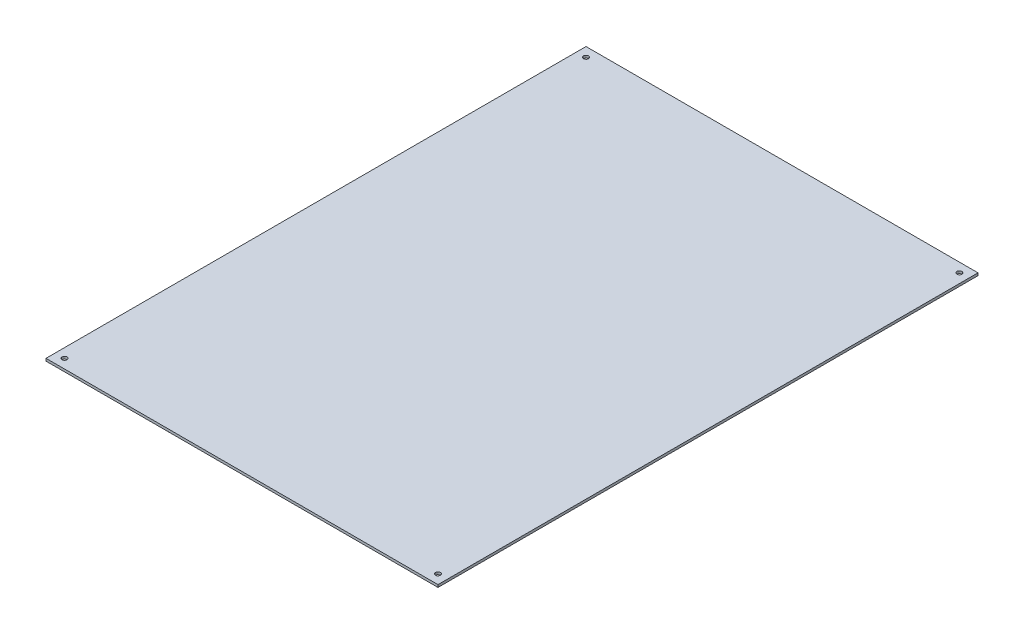
ISO-10303-21;
HEADER;
FILE_DESCRIPTION(('STEP AP214'),'2;1');
FILE_NAME('part.step','',(''),(''),'','','');
FILE_SCHEMA(('AUTOMOTIVE_DESIGN { 1 0 10303 214 1 1 1 1 }'));
ENDSEC;
DATA;
#1=APPLICATION_CONTEXT('core data for automotive mechanical design processes');
#2=APPLICATION_PROTOCOL_DEFINITION('international standard','automotive_design',2000,#1);
#3=PRODUCT_CONTEXT('',#1,'mechanical');
#4=PRODUCT('Part','Part','',(#3));
#5=PRODUCT_RELATED_PRODUCT_CATEGORY('part','',(#4));
#6=PRODUCT_DEFINITION_FORMATION('','',#4);
#7=PRODUCT_DEFINITION_CONTEXT('part definition',#1,'design');
#8=PRODUCT_DEFINITION('design','',#6,#7);
#9=PRODUCT_DEFINITION_SHAPE('','',#8);
#10=(LENGTH_UNIT() NAMED_UNIT(*) SI_UNIT(.MILLI.,.METRE.));
#11=(NAMED_UNIT(*) PLANE_ANGLE_UNIT() SI_UNIT($,.RADIAN.));
#12=(NAMED_UNIT(*) SI_UNIT($,.STERADIAN.) SOLID_ANGLE_UNIT());
#13=UNCERTAINTY_MEASURE_WITH_UNIT(LENGTH_MEASURE(1.E-05),#10,'distance_accuracy_value','');
#14=(GEOMETRIC_REPRESENTATION_CONTEXT(3) GLOBAL_UNCERTAINTY_ASSIGNED_CONTEXT((#13)) GLOBAL_UNIT_ASSIGNED_CONTEXT((#10,
#11,#12)) REPRESENTATION_CONTEXT('',''));
#15=CARTESIAN_POINT('',(0.,0.,0.));
#16=DIRECTION('',(0.,0.,1.));
#17=DIRECTION('',(1.,0.,0.));
#18=AXIS2_PLACEMENT_3D('',#15,#16,#17);
#19=CARTESIAN_POINT('',(157.875,0.,0.));
#20=DIRECTION('',(0.,0.,-1.));
#21=DIRECTION('',(-1.,0.,0.));
#22=AXIS2_PLACEMENT_3D('',#19,#20,#21);
#23=PLANE('',#22);
#24=DIRECTION('',(-1.,0.,0.));
#25=VECTOR('',#24,1.);
#26=CARTESIAN_POINT('',(157.875,2.,0.));
#27=LINE('',#26,#25);
#28=CARTESIAN_POINT('',(157.875,2.,0.));
#29=VERTEX_POINT('',#28);
#30=CARTESIAN_POINT('',(-157.875,2.,0.));
#31=VERTEX_POINT('',#30);
#32=EDGE_CURVE('E72',#29,#31,#27,.T.);
#33=ORIENTED_EDGE('',*,*,#32,.T.);
#34=DIRECTION('',(0.,-1.,0.));
#35=VECTOR('',#34,1.);
#36=CARTESIAN_POINT('',(-157.875,0.,0.));
#37=LINE('',#36,#35);
#38=CARTESIAN_POINT('',(-157.875,0.,0.));
#39=VERTEX_POINT('',#38);
#40=EDGE_CURVE('E75',#31,#39,#37,.T.);
#41=ORIENTED_EDGE('',*,*,#40,.T.);
#42=DIRECTION('',(-1.,0.,0.));
#43=VECTOR('',#42,1.);
#44=CARTESIAN_POINT('',(157.875,0.,0.));
#45=LINE('',#44,#43);
#46=CARTESIAN_POINT('',(157.875,0.,0.));
#47=VERTEX_POINT('',#46);
#48=EDGE_CURVE('E11',#47,#39,#45,.T.);
#49=ORIENTED_EDGE('',*,*,#48,.F.);
#50=DIRECTION('',(0.,-1.,0.));
#51=VECTOR('',#50,1.);
#52=CARTESIAN_POINT('',(157.875,0.,0.));
#53=LINE('',#52,#51);
#54=EDGE_CURVE('E77',#29,#47,#53,.T.);
#55=ORIENTED_EDGE('',*,*,#54,.F.);
#56=EDGE_LOOP('',(#33,#41,#49,#55));
#57=FACE_BOUND('',#56,.T.);
#58=ADVANCED_FACE('F33',(#57),#23,.F.);
#59=CARTESIAN_POINT('',(157.875,0.,0.));
#60=DIRECTION('',(0.,1.,0.));
#61=DIRECTION('',(0.,0.,1.));
#62=AXIS2_PLACEMENT_3D('',#59,#60,#61);
#63=PLANE('',#62);
#64=CARTESIAN_POINT('',(-150.375,0.,-427.5));
#65=DIRECTION('',(0.,1.,0.));
#66=DIRECTION('',(0.,0.,1.));
#67=AXIS2_PLACEMENT_3D('',#64,#65,#66);
#68=CIRCLE('',#67,2.);
#69=CARTESIAN_POINT('',(-150.375,0.,-425.5));
#70=VERTEX_POINT('',#69);
#71=EDGE_CURVE('E146',#70,#70,#68,.T.);
#72=ORIENTED_EDGE('',*,*,#71,.T.);
#73=EDGE_LOOP('',(#72));
#74=FACE_BOUND('',#73,.T.);
#75=CARTESIAN_POINT('',(-150.375,0.,-7.50000000000001));
#76=DIRECTION('',(0.,1.,0.));
#77=DIRECTION('',(0.,0.,1.));
#78=AXIS2_PLACEMENT_3D('',#75,#76,#77);
#79=CIRCLE('',#78,2.);
#80=CARTESIAN_POINT('',(-150.375,0.,-5.50000000000001));
#81=VERTEX_POINT('',#80);
#82=EDGE_CURVE('E150',#81,#81,#79,.T.);
#83=ORIENTED_EDGE('',*,*,#82,.T.);
#84=EDGE_LOOP('',(#83));
#85=FACE_BOUND('',#84,.T.);
#86=CARTESIAN_POINT('',(150.375,0.,-427.5));
#87=DIRECTION('',(0.,1.,0.));
#88=DIRECTION('',(0.,0.,1.));
#89=AXIS2_PLACEMENT_3D('',#86,#87,#88);
#90=CIRCLE('',#89,2.);
#91=CARTESIAN_POINT('',(150.375,0.,-425.5));
#92=VERTEX_POINT('',#91);
#93=EDGE_CURVE('E103',#92,#92,#90,.F.);
#94=ORIENTED_EDGE('',*,*,#93,.F.);
#95=EDGE_LOOP('',(#94));
#96=FACE_BOUND('',#95,.T.);
#97=CARTESIAN_POINT('',(150.375,0.,-7.50000000000001));
#98=DIRECTION('',(0.,1.,0.));
#99=DIRECTION('',(0.,0.,1.));
#100=AXIS2_PLACEMENT_3D('',#97,#98,#99);
#101=CIRCLE('',#100,2.);
#102=CARTESIAN_POINT('',(150.375,0.,-5.50000000000001));
#103=VERTEX_POINT('',#102);
#104=EDGE_CURVE('E104',#103,#103,#101,.F.);
#105=ORIENTED_EDGE('',*,*,#104,.F.);
#106=EDGE_LOOP('',(#105));
#107=FACE_BOUND('',#106,.T.);
#108=ORIENTED_EDGE('',*,*,#48,.T.);
#109=DIRECTION('',(0.,0.,-1.));
#110=VECTOR('',#109,1.);
#111=CARTESIAN_POINT('',(-157.875,0.,0.));
#112=LINE('',#111,#110);
#113=CARTESIAN_POINT('',(-157.875,0.,-435.));
#114=VERTEX_POINT('',#113);
#115=EDGE_CURVE('E89',#39,#114,#112,.T.);
#116=ORIENTED_EDGE('',*,*,#115,.T.);
#117=DIRECTION('',(-1.,0.,0.));
#118=VECTOR('',#117,1.);
#119=CARTESIAN_POINT('',(157.875,0.,-435.));
#120=LINE('',#119,#118);
#121=CARTESIAN_POINT('',(157.875,0.,-435.));
#122=VERTEX_POINT('',#121);
#123=EDGE_CURVE('E40',#122,#114,#120,.T.);
#124=ORIENTED_EDGE('',*,*,#123,.F.);
#125=DIRECTION('',(0.,0.,-1.));
#126=VECTOR('',#125,1.);
#127=CARTESIAN_POINT('',(157.875,0.,0.));
#128=LINE('',#127,#126);
#129=EDGE_CURVE('E112',#47,#122,#128,.T.);
#130=ORIENTED_EDGE('',*,*,#129,.F.);
#131=EDGE_LOOP('',(#108,#116,#124,#130));
#132=FACE_BOUND('',#131,.T.);
#133=ADVANCED_FACE('F120',(#74,#85,#96,#107,#132),#63,.F.);
#134=CARTESIAN_POINT('',(157.875,0.,-435.));
#135=DIRECTION('',(0.,0.,1.));
#136=DIRECTION('',(1.,0.,0.));
#137=AXIS2_PLACEMENT_3D('',#134,#135,#136);
#138=PLANE('',#137);
#139=ORIENTED_EDGE('',*,*,#123,.T.);
#140=DIRECTION('',(0.,1.,0.));
#141=VECTOR('',#140,1.);
#142=CARTESIAN_POINT('',(-157.875,0.,-435.));
#143=LINE('',#142,#141);
#144=CARTESIAN_POINT('',(-157.875,2.,-435.));
#145=VERTEX_POINT('',#144);
#146=EDGE_CURVE('E93',#114,#145,#143,.T.);
#147=ORIENTED_EDGE('',*,*,#146,.T.);
#148=DIRECTION('',(-1.,0.,0.));
#149=VECTOR('',#148,1.);
#150=CARTESIAN_POINT('',(157.875,2.,-435.));
#151=LINE('',#150,#149);
#152=CARTESIAN_POINT('',(157.875,2.,-435.));
#153=VERTEX_POINT('',#152);
#154=EDGE_CURVE('E80',#153,#145,#151,.T.);
#155=ORIENTED_EDGE('',*,*,#154,.F.);
#156=DIRECTION('',(0.,1.,0.));
#157=VECTOR('',#156,1.);
#158=CARTESIAN_POINT('',(157.875,0.,-435.));
#159=LINE('',#158,#157);
#160=EDGE_CURVE('E52',#122,#153,#159,.T.);
#161=ORIENTED_EDGE('',*,*,#160,.F.);
#162=EDGE_LOOP('',(#139,#147,#155,#161));
#163=FACE_BOUND('',#162,.T.);
#164=ADVANCED_FACE('F118',(#163),#138,.F.);
#165=CARTESIAN_POINT('',(157.875,2.,0.));
#166=DIRECTION('',(0.,-1.,0.));
#167=DIRECTION('',(0.,0.,-1.));
#168=AXIS2_PLACEMENT_3D('',#165,#166,#167);
#169=PLANE('',#168);
#170=CARTESIAN_POINT('',(-150.375,2.,-427.5));
#171=DIRECTION('',(0.,-1.,0.));
#172=DIRECTION('',(0.,0.,1.));
#173=AXIS2_PLACEMENT_3D('',#170,#171,#172);
#174=CIRCLE('',#173,2.);
#175=CARTESIAN_POINT('',(-150.375,2.,-425.5));
#176=VERTEX_POINT('',#175);
#177=EDGE_CURVE('E90',#176,#176,#174,.T.);
#178=ORIENTED_EDGE('',*,*,#177,.T.);
#179=EDGE_LOOP('',(#178));
#180=FACE_BOUND('',#179,.T.);
#181=CARTESIAN_POINT('',(-150.375,2.,-7.50000000000001));
#182=DIRECTION('',(0.,-1.,0.));
#183=DIRECTION('',(0.,0.,1.));
#184=AXIS2_PLACEMENT_3D('',#181,#182,#183);
#185=CIRCLE('',#184,2.);
#186=CARTESIAN_POINT('',(-150.375,2.,-5.50000000000001));
#187=VERTEX_POINT('',#186);
#188=EDGE_CURVE('E176',#187,#187,#185,.T.);
#189=ORIENTED_EDGE('',*,*,#188,.T.);
#190=EDGE_LOOP('',(#189));
#191=FACE_BOUND('',#190,.T.);
#192=CARTESIAN_POINT('',(150.375,2.,-427.5));
#193=DIRECTION('',(0.,1.,0.));
#194=DIRECTION('',(0.,0.,1.));
#195=AXIS2_PLACEMENT_3D('',#192,#193,#194);
#196=CIRCLE('',#195,2.);
#197=CARTESIAN_POINT('',(150.375,2.,-425.5));
#198=VERTEX_POINT('',#197);
#199=EDGE_CURVE('E100',#198,#198,#196,.T.);
#200=ORIENTED_EDGE('',*,*,#199,.F.);
#201=EDGE_LOOP('',(#200));
#202=FACE_BOUND('',#201,.T.);
#203=CARTESIAN_POINT('',(150.375,2.,-7.50000000000001));
#204=DIRECTION('',(0.,1.,0.));
#205=DIRECTION('',(0.,0.,1.));
#206=AXIS2_PLACEMENT_3D('',#203,#204,#205);
#207=CIRCLE('',#206,2.);
#208=CARTESIAN_POINT('',(150.375,2.,-5.50000000000001));
#209=VERTEX_POINT('',#208);
#210=EDGE_CURVE('E99',#209,#209,#207,.T.);
#211=ORIENTED_EDGE('',*,*,#210,.F.);
#212=EDGE_LOOP('',(#211));
#213=FACE_BOUND('',#212,.T.);
#214=ORIENTED_EDGE('',*,*,#154,.T.);
#215=DIRECTION('',(0.,0.,1.));
#216=VECTOR('',#215,1.);
#217=CARTESIAN_POINT('',(-157.875,2.,0.));
#218=LINE('',#217,#216);
#219=EDGE_CURVE('E86',#145,#31,#218,.T.);
#220=ORIENTED_EDGE('',*,*,#219,.T.);
#221=ORIENTED_EDGE('',*,*,#32,.F.);
#222=DIRECTION('',(0.,0.,1.));
#223=VECTOR('',#222,1.);
#224=CARTESIAN_POINT('',(157.875,2.,0.));
#225=LINE('',#224,#223);
#226=EDGE_CURVE('E47',#153,#29,#225,.T.);
#227=ORIENTED_EDGE('',*,*,#226,.F.);
#228=EDGE_LOOP('',(#214,#220,#221,#227));
#229=FACE_BOUND('',#228,.T.);
#230=ADVANCED_FACE('F92',(#180,#191,#202,#213,#229),#169,.F.);
#231=CARTESIAN_POINT('',(157.875,0.,0.));
#232=DIRECTION('',(-1.,0.,0.));
#233=DIRECTION('',(0.,0.,1.));
#234=AXIS2_PLACEMENT_3D('',#231,#232,#233);
#235=PLANE('',#234);
#236=ORIENTED_EDGE('',*,*,#54,.T.);
#237=ORIENTED_EDGE('',*,*,#129,.T.);
#238=ORIENTED_EDGE('',*,*,#160,.T.);
#239=ORIENTED_EDGE('',*,*,#226,.T.);
#240=EDGE_LOOP('',(#236,#237,#238,#239));
#241=FACE_BOUND('',#240,.T.);
#242=ADVANCED_FACE('F121',(#241),#235,.F.);
#243=CARTESIAN_POINT('',(150.375,-0.00100000000000013,-7.50000000000001));
#244=DIRECTION('',(0.,1.,0.));
#245=DIRECTION('',(0.,0.,1.));
#246=AXIS2_PLACEMENT_3D('',#243,#244,#245);
#247=CYLINDRICAL_SURFACE('',#246,2.);
#248=ORIENTED_EDGE('',*,*,#210,.T.);
#249=EDGE_LOOP('',(#248));
#250=FACE_BOUND('',#249,.T.);
#251=ORIENTED_EDGE('',*,*,#104,.T.);
#252=EDGE_LOOP('',(#251));
#253=FACE_BOUND('',#252,.T.);
#254=ADVANCED_FACE('F123',(#250,#253),#247,.F.);
#255=CARTESIAN_POINT('',(150.375,-0.00100000000000013,-427.5));
#256=DIRECTION('',(0.,1.,0.));
#257=DIRECTION('',(0.,0.,1.));
#258=AXIS2_PLACEMENT_3D('',#255,#256,#257);
#259=CYLINDRICAL_SURFACE('',#258,2.);
#260=ORIENTED_EDGE('',*,*,#199,.T.);
#261=EDGE_LOOP('',(#260));
#262=FACE_BOUND('',#261,.T.);
#263=ORIENTED_EDGE('',*,*,#93,.T.);
#264=EDGE_LOOP('',(#263));
#265=FACE_BOUND('',#264,.T.);
#266=ADVANCED_FACE('F129',(#262,#265),#259,.F.);
#267=CARTESIAN_POINT('',(-157.875,0.,0.));
#268=DIRECTION('',(1.,0.,0.));
#269=DIRECTION('',(0.,0.,1.));
#270=AXIS2_PLACEMENT_3D('',#267,#268,#269);
#271=PLANE('',#270);
#272=ORIENTED_EDGE('',*,*,#40,.F.);
#273=ORIENTED_EDGE('',*,*,#219,.F.);
#274=ORIENTED_EDGE('',*,*,#146,.F.);
#275=ORIENTED_EDGE('',*,*,#115,.F.);
#276=EDGE_LOOP('',(#272,#273,#274,#275));
#277=FACE_BOUND('',#276,.T.);
#278=ADVANCED_FACE('F84',(#277),#271,.F.);
#279=CARTESIAN_POINT('',(-150.375,-0.00100000000000013,-7.50000000000001));
#280=DIRECTION('',(0.,1.,0.));
#281=DIRECTION('',(0.,0.,1.));
#282=AXIS2_PLACEMENT_3D('',#279,#280,#281);
#283=CYLINDRICAL_SURFACE('',#282,2.);
#284=ORIENTED_EDGE('',*,*,#188,.F.);
#285=EDGE_LOOP('',(#284));
#286=FACE_BOUND('',#285,.T.);
#287=ORIENTED_EDGE('',*,*,#82,.F.);
#288=EDGE_LOOP('',(#287));
#289=FACE_BOUND('',#288,.T.);
#290=ADVANCED_FACE('F162',(#286,#289),#283,.F.);
#291=CARTESIAN_POINT('',(-150.375,-0.00100000000000013,-427.5));
#292=DIRECTION('',(0.,1.,0.));
#293=DIRECTION('',(0.,0.,1.));
#294=AXIS2_PLACEMENT_3D('',#291,#292,#293);
#295=CYLINDRICAL_SURFACE('',#294,2.);
#296=ORIENTED_EDGE('',*,*,#177,.F.);
#297=EDGE_LOOP('',(#296));
#298=FACE_BOUND('',#297,.T.);
#299=ORIENTED_EDGE('',*,*,#71,.F.);
#300=EDGE_LOOP('',(#299));
#301=FACE_BOUND('',#300,.T.);
#302=ADVANCED_FACE('F167',(#298,#301),#295,.F.);
#303=CLOSED_SHELL('',(#58,#133,#164,#230,#242,#254,#266,#278,#290,#302));
#304=MANIFOLD_SOLID_BREP('B2',#303);
#305=ADVANCED_BREP_SHAPE_REPRESENTATION('',(#18,#304),#14);
#306=SHAPE_DEFINITION_REPRESENTATION(#9,#305);
ENDSEC;
END-ISO-10303-21;
